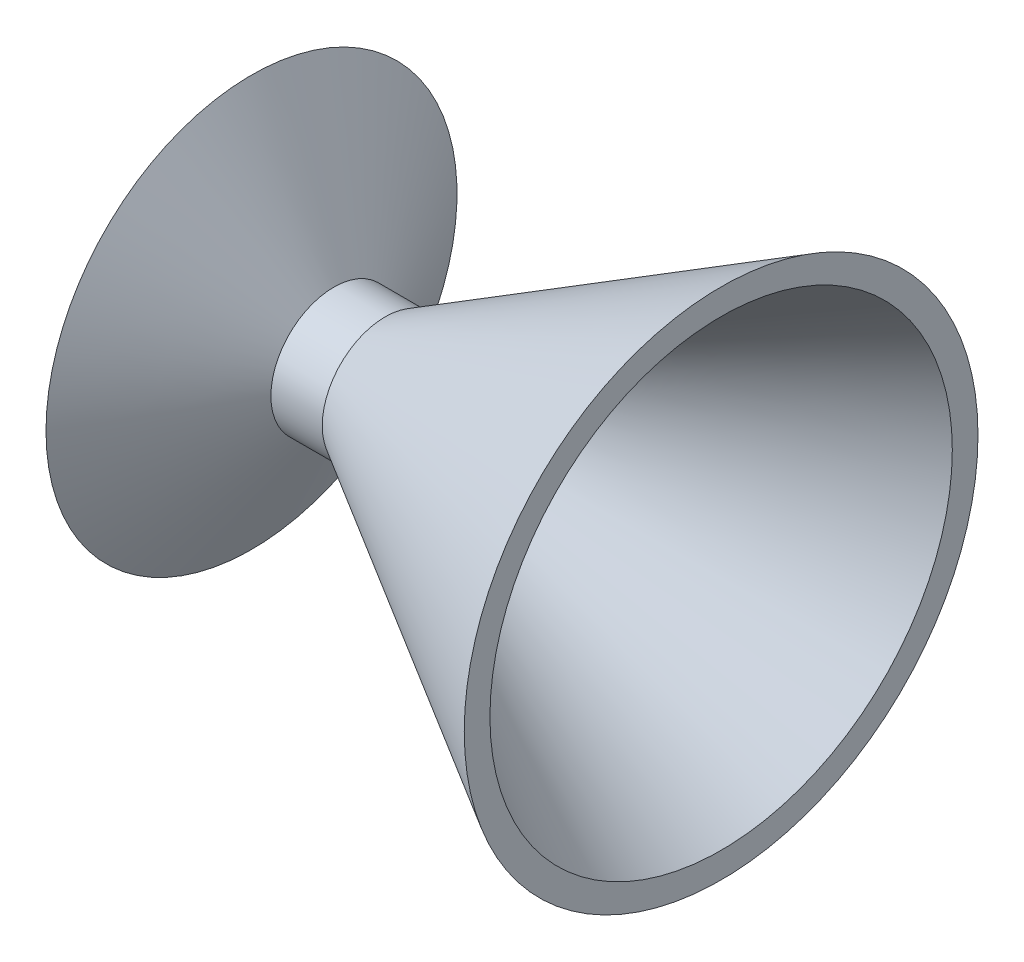
ISO-10303-21;
HEADER;
FILE_DESCRIPTION(('STEP AP214'),'2;1');
FILE_NAME('part.step','',(''),(''),'','','');
FILE_SCHEMA(('AUTOMOTIVE_DESIGN { 1 0 10303 214 1 1 1 1 }'));
ENDSEC;
DATA;
#1=APPLICATION_CONTEXT('core data for automotive mechanical design processes');
#2=APPLICATION_PROTOCOL_DEFINITION('international standard','automotive_design',2000,#1);
#3=PRODUCT_CONTEXT('',#1,'mechanical');
#4=PRODUCT('Part','Part','',(#3));
#5=PRODUCT_RELATED_PRODUCT_CATEGORY('part','',(#4));
#6=PRODUCT_DEFINITION_FORMATION('','',#4);
#7=PRODUCT_DEFINITION_CONTEXT('part definition',#1,'design');
#8=PRODUCT_DEFINITION('design','',#6,#7);
#9=PRODUCT_DEFINITION_SHAPE('','',#8);
#10=(LENGTH_UNIT() NAMED_UNIT(*) SI_UNIT(.MILLI.,.METRE.));
#11=(NAMED_UNIT(*) PLANE_ANGLE_UNIT() SI_UNIT($,.RADIAN.));
#12=(NAMED_UNIT(*) SI_UNIT($,.STERADIAN.) SOLID_ANGLE_UNIT());
#13=UNCERTAINTY_MEASURE_WITH_UNIT(LENGTH_MEASURE(1.E-05),#10,'distance_accuracy_value','');
#14=(GEOMETRIC_REPRESENTATION_CONTEXT(3) GLOBAL_UNCERTAINTY_ASSIGNED_CONTEXT((#13)) GLOBAL_UNIT_ASSIGNED_CONTEXT((#10,
#11,#12)) REPRESENTATION_CONTEXT('',''));
#15=CARTESIAN_POINT('',(0.,0.,0.));
#16=DIRECTION('',(0.,0.,1.));
#17=DIRECTION('',(1.,0.,0.));
#18=AXIS2_PLACEMENT_3D('',#15,#16,#17);
#19=CARTESIAN_POINT('',(0.,0.,0.));
#20=DIRECTION('',(-1.,0.,0.));
#21=DIRECTION('',(0.,0.,1.));
#22=AXIS2_PLACEMENT_3D('',#19,#20,#21);
#23=CYLINDRICAL_SURFACE('',#22,15.5575);
#24=CARTESIAN_POINT('',(-12.7,0.,0.));
#25=DIRECTION('',(-1.,0.,0.));
#26=DIRECTION('',(0.,0.,1.));
#27=AXIS2_PLACEMENT_3D('',#24,#25,#26);
#28=CIRCLE('',#27,15.5575);
#29=CARTESIAN_POINT('',(-12.7,0.,15.5575));
#30=VERTEX_POINT('',#29);
#31=EDGE_CURVE('E10',#30,#30,#28,.T.);
#32=ORIENTED_EDGE('',*,*,#31,.F.);
#33=EDGE_LOOP('',(#32));
#34=FACE_BOUND('',#33,.T.);
#35=CARTESIAN_POINT('',(0.,0.,0.));
#36=DIRECTION('',(-1.,0.,0.));
#37=DIRECTION('',(0.,0.,1.));
#38=AXIS2_PLACEMENT_3D('',#35,#36,#37);
#39=CIRCLE('',#38,15.5575);
#40=CARTESIAN_POINT('',(0.,0.,-15.5575));
#41=VERTEX_POINT('',#40);
#42=EDGE_CURVE('E62',#41,#41,#39,.T.);
#43=ORIENTED_EDGE('',*,*,#42,.T.);
#44=EDGE_LOOP('',(#43));
#45=FACE_BOUND('',#44,.T.);
#46=ADVANCED_FACE('F34',(#34,#45),#23,.T.);
#47=CARTESIAN_POINT('',(-12.7,0.,0.));
#48=DIRECTION('',(-1.,0.,0.));
#49=DIRECTION('',(0.,0.,1.));
#50=AXIS2_PLACEMENT_3D('',#47,#48,#49);
#51=CONICAL_SURFACE('',#50,15.5575,1.04719755119659);
#52=CARTESIAN_POINT('',(-33.0472668619156,0.,0.));
#53=DIRECTION('',(-1.,0.,0.));
#54=DIRECTION('',(0.,0.,1.));
#55=AXIS2_PLACEMENT_3D('',#52,#53,#54);
#56=CIRCLE('',#55,50.8);
#57=CARTESIAN_POINT('',(-33.0472668619156,0.,50.8));
#58=VERTEX_POINT('',#57);
#59=EDGE_CURVE('E40',#58,#58,#56,.T.);
#60=CARTESIAN_POINT('',(-33.0472668619156,0.,50.8));
#61=CARTESIAN_POINT('',(-32.8353161654373,0.,50.432890625));
#62=CARTESIAN_POINT('',(-32.623365468959,0.,50.06578125));
#63=CARTESIAN_POINT('',(-32.1994640760025,0.,49.3315625));
#64=CARTESIAN_POINT('',(-31.9875133795242,0.,48.964453125));
#65=CARTESIAN_POINT('',(-31.5636119865676,0.,48.230234375));
#66=CARTESIAN_POINT('',(-31.3516612900893,0.,47.863125));
#67=CARTESIAN_POINT('',(-30.9277598971327,0.,47.12890625));
#68=CARTESIAN_POINT('',(-30.7158092006545,0.,46.761796875));
#69=CARTESIAN_POINT('',(-30.2919078076979,0.,46.027578125));
#70=CARTESIAN_POINT('',(-30.0799571112196,0.,45.66046875));
#71=CARTESIAN_POINT('',(-29.656055718263,0.,44.92625));
#72=CARTESIAN_POINT('',(-29.4441050217847,0.,44.559140625));
#73=CARTESIAN_POINT('',(-29.0202036288281,0.,43.824921875));
#74=CARTESIAN_POINT('',(-28.8082529323499,0.,43.4578125));
#75=CARTESIAN_POINT('',(-28.3843515393933,0.,42.72359375));
#76=CARTESIAN_POINT('',(-28.172400842915,0.,42.356484375));
#77=CARTESIAN_POINT('',(-27.7484994499584,0.,41.622265625));
#78=CARTESIAN_POINT('',(-27.5365487534801,0.,41.25515625));
#79=CARTESIAN_POINT('',(-27.1126473605236,0.,40.5209375));
#80=CARTESIAN_POINT('',(-26.9006966640453,0.,40.153828125));
#81=CARTESIAN_POINT('',(-26.4767952710887,0.,39.419609375));
#82=CARTESIAN_POINT('',(-26.2648445746104,0.,39.0525));
#83=CARTESIAN_POINT('',(-25.8409431816538,0.,38.31828125));
#84=CARTESIAN_POINT('',(-25.6289924851755,0.,37.951171875));
#85=CARTESIAN_POINT('',(-25.205091092219,0.,37.216953125));
#86=CARTESIAN_POINT('',(-24.9931403957407,0.,36.84984375));
#87=CARTESIAN_POINT('',(-24.5692390027841,0.,36.115625));
#88=CARTESIAN_POINT('',(-24.3572883063058,0.,35.748515625));
#89=CARTESIAN_POINT('',(-23.9333869133492,0.,35.014296875));
#90=CARTESIAN_POINT('',(-23.721436216871,0.,34.6471875));
#91=CARTESIAN_POINT('',(-23.2975348239144,0.,33.91296875));
#92=CARTESIAN_POINT('',(-23.0855841274361,0.,33.545859375));
#93=CARTESIAN_POINT('',(-22.6616827344795,0.,32.811640625));
#94=CARTESIAN_POINT('',(-22.4497320380012,0.,32.44453125));
#95=CARTESIAN_POINT('',(-22.0258306450447,0.,31.7103125));
#96=CARTESIAN_POINT('',(-21.8138799485664,0.,31.343203125));
#97=CARTESIAN_POINT('',(-21.3899785556098,0.,30.608984375));
#98=CARTESIAN_POINT('',(-21.1780278591315,0.,30.241875));
#99=CARTESIAN_POINT('',(-20.7541264661749,0.,29.50765625));
#100=CARTESIAN_POINT('',(-20.5421757696966,0.,29.140546875));
#101=CARTESIAN_POINT('',(-20.1182743767401,0.,28.406328125));
#102=CARTESIAN_POINT('',(-19.9063236802618,0.,28.03921875));
#103=CARTESIAN_POINT('',(-19.4824222873052,0.,27.305));
#104=CARTESIAN_POINT('',(-19.2704715908269,0.,26.937890625));
#105=CARTESIAN_POINT('',(-18.8465701978703,0.,26.203671875));
#106=CARTESIAN_POINT('',(-18.6346195013921,0.,25.8365625));
#107=CARTESIAN_POINT('',(-18.2107181084355,0.,25.10234375));
#108=CARTESIAN_POINT('',(-17.9987674119572,0.,24.735234375));
#109=CARTESIAN_POINT('',(-17.5748660190006,0.,24.001015625));
#110=CARTESIAN_POINT('',(-17.3629153225223,0.,23.63390625));
#111=CARTESIAN_POINT('',(-16.9390139295658,0.,22.8996875));
#112=CARTESIAN_POINT('',(-16.7270632330875,0.,22.532578125));
#113=CARTESIAN_POINT('',(-16.3031618401309,0.,21.798359375));
#114=CARTESIAN_POINT('',(-16.0912111436526,0.,21.43125));
#115=CARTESIAN_POINT('',(-15.667309750696,0.,20.69703125));
#116=CARTESIAN_POINT('',(-15.4553590542177,0.,20.329921875));
#117=CARTESIAN_POINT('',(-15.0314576612612,0.,19.595703125));
#118=CARTESIAN_POINT('',(-14.8195069647829,0.,19.22859375));
#119=CARTESIAN_POINT('',(-14.3956055718263,0.,18.494375));
#120=CARTESIAN_POINT('',(-14.183654875348,0.,18.127265625));
#121=CARTESIAN_POINT('',(-13.7597534823914,0.,17.393046875));
#122=CARTESIAN_POINT('',(-13.5478027859132,0.,17.0259375));
#123=CARTESIAN_POINT('',(-13.1239013929566,0.,16.29171875));
#124=CARTESIAN_POINT('',(-12.9119506964783,0.,15.924609375));
#125=CARTESIAN_POINT('',(-12.7,0.,15.5575));
#126=B_SPLINE_CURVE_WITH_KNOTS('',3,(#60,#61,#62,#63,#64,#65,#66,#67,#68,#69,#70,#71,#72,#73,
#74,#75,#76,#77,#78,#79,#80,#81,#82,#83,#84,#85,#86,#87,#88,#89,#90,#91,#92,#93,#94,#95,#96,#97,
#98,#99,#100,#101,#102,#103,#104,#105,#106,#107,#108,#109,#110,#111,#112,#113,#114,#115,#116,
#117,#118,#119,#120,#121,#122,#123,#124,#125),.UNSPECIFIED.,.F.,.F.,(4,2,2,2,2,2,2,2,2,2,2,2,2,
2,2,2,2,2,2,2,2,2,2,2,2,2,2,2,2,2,2,2,4),(0.,1.27170417886971,2.54340835773943,3.81511253660914,
5.08681671547886,6.35852089434857,7.63022507321829,8.90192925208801,10.1736334309577,
11.4453376098274,12.7170417886972,13.9887459675669,15.2604501464366,16.5321543253063,
17.803858504176,19.0755626830457,20.3472668619154,21.6189710407852,22.8906752196549,
24.1623793985246,25.4340835773943,26.705787756264,27.9774919351337,29.2491961140034,
30.5209002928732,31.7926044717429,33.0643086506126,34.3360128294823,35.607717008352,
36.8794211872217,38.1511253660915,39.4228295449612,40.6945337238309),.UNSPECIFIED.);
#127=EDGE_CURVE('BSEAM99',#58,#30,#126,.T.);
#128=ORIENTED_EDGE('',*,*,#59,.F.);
#129=ORIENTED_EDGE('',*,*,#31,.T.);
#130=ORIENTED_EDGE('',*,*,#127,.T.);
#131=ORIENTED_EDGE('',*,*,#127,.F.);
#132=EDGE_LOOP('',(#128,#130,#129,#131));
#133=FACE_BOUND('',#132,.T.);
#134=ADVANCED_FACE('F99',(#133),#51,.T.);
#135=CARTESIAN_POINT('',(-33.0472668619156,50.8,0.));
#136=DIRECTION('',(1.,0.,0.));
#137=DIRECTION('',(0.,0.,-1.));
#138=AXIS2_PLACEMENT_3D('',#135,#136,#137);
#139=PLANE('',#138);
#140=CARTESIAN_POINT('',(-33.0472668619156,0.,0.));
#141=DIRECTION('',(-1.,0.,0.));
#142=DIRECTION('',(0.,0.,1.));
#143=AXIS2_PLACEMENT_3D('',#140,#141,#142);
#144=CIRCLE('',#143,41.275);
#145=CARTESIAN_POINT('',(-33.0472668619156,0.,41.275));
#146=VERTEX_POINT('',#145);
#147=EDGE_CURVE('E44',#146,#146,#144,.T.);
#148=ORIENTED_EDGE('',*,*,#147,.F.);
#149=EDGE_LOOP('',(#148));
#150=FACE_BOUND('',#149,.T.);
#151=ORIENTED_EDGE('',*,*,#59,.T.);
#152=EDGE_LOOP('',(#151));
#153=FACE_BOUND('',#152,.T.);
#154=ADVANCED_FACE('F94',(#150,#153),#139,.F.);
#155=CARTESIAN_POINT('',(-33.0472668619156,0.,0.));
#156=DIRECTION('',(-1.,0.,0.));
#157=DIRECTION('',(0.,0.,1.));
#158=AXIS2_PLACEMENT_3D('',#155,#156,#157);
#159=CONICAL_SURFACE('',#158,41.275,1.02280730700641);
#160=CARTESIAN_POINT('',(-12.7,0.,0.));
#161=DIRECTION('',(-1.,0.,0.));
#162=DIRECTION('',(0.,0.,1.));
#163=AXIS2_PLACEMENT_3D('',#160,#161,#162);
#164=CIRCLE('',#163,7.9375);
#165=CARTESIAN_POINT('',(-12.7,0.,7.9375));
#166=VERTEX_POINT('',#165);
#167=EDGE_CURVE('E48',#166,#166,#164,.T.);
#168=CARTESIAN_POINT('',(-12.7,0.,7.9375));
#169=CARTESIAN_POINT('',(-12.9119506964783,0.,8.284765625));
#170=CARTESIAN_POINT('',(-13.1239013929566,0.,8.63203125));
#171=CARTESIAN_POINT('',(-13.5478027859131,0.,9.3265625));
#172=CARTESIAN_POINT('',(-13.7597534823914,0.,9.673828125));
#173=CARTESIAN_POINT('',(-14.183654875348,0.,10.368359375));
#174=CARTESIAN_POINT('',(-14.3956055718263,0.,10.715625));
#175=CARTESIAN_POINT('',(-14.8195069647829,0.,11.41015625));
#176=CARTESIAN_POINT('',(-15.0314576612612,0.,11.757421875));
#177=CARTESIAN_POINT('',(-15.4553590542177,0.,12.451953125));
#178=CARTESIAN_POINT('',(-15.667309750696,0.,12.79921875));
#179=CARTESIAN_POINT('',(-16.0912111436526,0.,13.49375));
#180=CARTESIAN_POINT('',(-16.3031618401309,0.,13.841015625));
#181=CARTESIAN_POINT('',(-16.7270632330875,0.,14.535546875));
#182=CARTESIAN_POINT('',(-16.9390139295658,0.,14.8828125));
#183=CARTESIAN_POINT('',(-17.3629153225223,0.,15.57734375));
#184=CARTESIAN_POINT('',(-17.5748660190006,0.,15.924609375));
#185=CARTESIAN_POINT('',(-17.9987674119572,0.,16.619140625));
#186=CARTESIAN_POINT('',(-18.2107181084355,0.,16.96640625));
#187=CARTESIAN_POINT('',(-18.6346195013921,0.,17.6609375));
#188=CARTESIAN_POINT('',(-18.8465701978703,0.,18.008203125));
#189=CARTESIAN_POINT('',(-19.2704715908269,0.,18.702734375));
#190=CARTESIAN_POINT('',(-19.4824222873052,0.,19.05));
#191=CARTESIAN_POINT('',(-19.9063236802618,0.,19.74453125));
#192=CARTESIAN_POINT('',(-20.1182743767401,0.,20.091796875));
#193=CARTESIAN_POINT('',(-20.5421757696966,0.,20.786328125));
#194=CARTESIAN_POINT('',(-20.7541264661749,0.,21.13359375));
#195=CARTESIAN_POINT('',(-21.1780278591315,0.,21.828125));
#196=CARTESIAN_POINT('',(-21.3899785556098,0.,22.175390625));
#197=CARTESIAN_POINT('',(-21.8138799485664,0.,22.869921875));
#198=CARTESIAN_POINT('',(-22.0258306450447,0.,23.2171875));
#199=CARTESIAN_POINT('',(-22.4497320380012,0.,23.91171875));
#200=CARTESIAN_POINT('',(-22.6616827344795,0.,24.258984375));
#201=CARTESIAN_POINT('',(-23.0855841274361,0.,24.953515625));
#202=CARTESIAN_POINT('',(-23.2975348239144,0.,25.30078125));
#203=CARTESIAN_POINT('',(-23.721436216871,0.,25.9953125));
#204=CARTESIAN_POINT('',(-23.9333869133493,0.,26.342578125));
#205=CARTESIAN_POINT('',(-24.3572883063058,0.,27.037109375));
#206=CARTESIAN_POINT('',(-24.5692390027841,0.,27.384375));
#207=CARTESIAN_POINT('',(-24.9931403957407,0.,28.07890625));
#208=CARTESIAN_POINT('',(-25.205091092219,0.,28.426171875));
#209=CARTESIAN_POINT('',(-25.6289924851755,0.,29.120703125));
#210=CARTESIAN_POINT('',(-25.8409431816538,0.,29.46796875));
#211=CARTESIAN_POINT('',(-26.2648445746104,0.,30.1625));
#212=CARTESIAN_POINT('',(-26.4767952710887,0.,30.509765625));
#213=CARTESIAN_POINT('',(-26.9006966640453,0.,31.204296875));
#214=CARTESIAN_POINT('',(-27.1126473605236,0.,31.5515625));
#215=CARTESIAN_POINT('',(-27.5365487534801,0.,32.24609375));
#216=CARTESIAN_POINT('',(-27.7484994499584,0.,32.593359375));
#217=CARTESIAN_POINT('',(-28.172400842915,0.,33.287890625));
#218=CARTESIAN_POINT('',(-28.3843515393933,0.,33.63515625));
#219=CARTESIAN_POINT('',(-28.8082529323499,0.,34.3296875));
#220=CARTESIAN_POINT('',(-29.0202036288282,0.,34.676953125));
#221=CARTESIAN_POINT('',(-29.4441050217847,0.,35.371484375));
#222=CARTESIAN_POINT('',(-29.656055718263,0.,35.71875));
#223=CARTESIAN_POINT('',(-30.0799571112196,0.,36.41328125));
#224=CARTESIAN_POINT('',(-30.2919078076979,0.,36.760546875));
#225=CARTESIAN_POINT('',(-30.7158092006545,0.,37.455078125));
#226=CARTESIAN_POINT('',(-30.9277598971327,0.,37.80234375));
#227=CARTESIAN_POINT('',(-31.3516612900893,0.,38.496875));
#228=CARTESIAN_POINT('',(-31.5636119865676,0.,38.844140625));
#229=CARTESIAN_POINT('',(-31.9875133795242,0.,39.538671875));
#230=CARTESIAN_POINT('',(-32.1994640760025,0.,39.8859375));
#231=CARTESIAN_POINT('',(-32.623365468959,0.,40.58046875));
#232=CARTESIAN_POINT('',(-32.8353161654373,0.,40.927734375));
#233=CARTESIAN_POINT('',(-33.0472668619156,0.,41.275));
#234=B_SPLINE_CURVE_WITH_KNOTS('',3,(#168,#169,#170,#171,#172,#173,#174,#175,#176,#177,#178,
#179,#180,#181,#182,#183,#184,#185,#186,#187,#188,#189,#190,#191,#192,#193,#194,#195,#196,#197,
#198,#199,#200,#201,#202,#203,#204,#205,#206,#207,#208,#209,#210,#211,#212,#213,#214,#215,#216,
#217,#218,#219,#220,#221,#222,#223,#224,#225,#226,#227,#228,#229,#230,#231,#232,#233),
.UNSPECIFIED.,.F.,.F.,(4,2,2,2,2,2,2,2,2,2,2,2,2,2,2,2,2,2,2,2,2,2,2,2,2,2,2,2,2,2,2,2,4),(0.,
1.22051161747787,2.44102323495574,3.66153485243361,4.88204646991148,6.10255808738935,
7.32306970486722,8.54358132234509,9.76409293982296,10.9846045573008,12.2051161747787,
13.4256277922566,14.6461394097344,15.8666510272123,17.0871626446902,18.307674262168,
19.5281858796459,20.7486974971238,21.9692091146017,23.1897207320795,24.4102323495574,
25.6307439670353,26.8512555845131,28.071767201991,29.2922788194689,30.5127904369468,
31.7333020544246,32.9538136719025,34.1743252893804,35.3948369068582,36.6153485243361,
37.835860141814,39.0563717592918),.UNSPECIFIED.);
#235=EDGE_CURVE('BSEAM88',#166,#146,#234,.T.);
#236=ORIENTED_EDGE('',*,*,#167,.F.);
#237=ORIENTED_EDGE('',*,*,#147,.T.);
#238=ORIENTED_EDGE('',*,*,#235,.T.);
#239=ORIENTED_EDGE('',*,*,#235,.F.);
#240=EDGE_LOOP('',(#236,#238,#237,#239));
#241=FACE_BOUND('',#240,.T.);
#242=ADVANCED_FACE('F88',(#241),#159,.F.);
#243=CARTESIAN_POINT('',(0.,0.,0.));
#244=DIRECTION('',(-1.,0.,0.));
#245=DIRECTION('',(0.,0.,1.));
#246=AXIS2_PLACEMENT_3D('',#243,#244,#245);
#247=CYLINDRICAL_SURFACE('',#246,7.9375);
#248=CARTESIAN_POINT('',(0.,0.,0.));
#249=DIRECTION('',(-1.,0.,0.));
#250=DIRECTION('',(0.,0.,1.));
#251=AXIS2_PLACEMENT_3D('',#248,#249,#250);
#252=CIRCLE('',#251,7.9375);
#253=CARTESIAN_POINT('',(0.,0.,-7.9375));
#254=VERTEX_POINT('',#253);
#255=EDGE_CURVE('E53',#254,#254,#252,.T.);
#256=ORIENTED_EDGE('',*,*,#255,.F.);
#257=EDGE_LOOP('',(#256));
#258=FACE_BOUND('',#257,.T.);
#259=ORIENTED_EDGE('',*,*,#167,.T.);
#260=EDGE_LOOP('',(#259));
#261=FACE_BOUND('',#260,.T.);
#262=ADVANCED_FACE('F82',(#258,#261),#247,.F.);
#263=CARTESIAN_POINT('',(0.,0.,0.));
#264=DIRECTION('',(1.,0.,0.));
#265=DIRECTION('',(0.,0.,-1.));
#266=AXIS2_PLACEMENT_3D('',#263,#264,#265);
#267=CONICAL_SURFACE('',#266,7.9375,0.534993353531431);
#268=CARTESIAN_POINT('',(83.0388458418706,0.,0.));
#269=DIRECTION('',(-1.,0.,0.));
#270=DIRECTION('',(0.,0.,1.));
#271=AXIS2_PLACEMENT_3D('',#268,#269,#270);
#272=CIRCLE('',#271,57.15);
#273=CARTESIAN_POINT('',(83.0388458418706,0.,-57.15));
#274=VERTEX_POINT('',#273);
#275=EDGE_CURVE('E56',#274,#274,#272,.T.);
#276=CARTESIAN_POINT('',(83.0388458418706,0.,-57.15));
#277=CARTESIAN_POINT('',(82.1738578643511,0.,-56.6373697916667));
#278=CARTESIAN_POINT('',(81.3088698868317,0.,-56.1247395833333));
#279=CARTESIAN_POINT('',(79.5788939317927,0.,-55.0994791666667));
#280=CARTESIAN_POINT('',(78.7139059542732,0.,-54.5868489583333));
#281=CARTESIAN_POINT('',(76.9839299992342,0.,-53.5615885416667));
#282=CARTESIAN_POINT('',(76.1189420217147,0.,-53.0489583333333));
#283=CARTESIAN_POINT('',(74.3889660666758,0.,-52.0236979166667));
#284=CARTESIAN_POINT('',(73.5239780891563,0.,-51.5110677083333));
#285=CARTESIAN_POINT('',(71.7940021341173,0.,-50.4858072916667));
#286=CARTESIAN_POINT('',(70.9290141565978,0.,-49.9731770833333));
#287=CARTESIAN_POINT('',(69.1990382015589,0.,-48.9479166666667));
#288=CARTESIAN_POINT('',(68.3340502240394,0.,-48.4352864583333));
#289=CARTESIAN_POINT('',(66.6040742690004,0.,-47.4100260416667));
#290=CARTESIAN_POINT('',(65.7390862914809,0.,-46.8973958333333));
#291=CARTESIAN_POINT('',(64.0091103364419,0.,-45.8721354166667));
#292=CARTESIAN_POINT('',(63.1441223589225,0.,-45.3595052083333));
#293=CARTESIAN_POINT('',(61.4141464038835,0.,-44.3342447916667));
#294=CARTESIAN_POINT('',(60.549158426364,0.,-43.8216145833333));
#295=CARTESIAN_POINT('',(58.819182471325,0.,-42.7963541666667));
#296=CARTESIAN_POINT('',(57.9541944938055,0.,-42.2837239583333));
#297=CARTESIAN_POINT('',(56.2242185387666,0.,-41.2584635416667));
#298=CARTESIAN_POINT('',(55.3592305612471,0.,-40.7458333333333));
#299=CARTESIAN_POINT('',(53.6292546062081,0.,-39.7205729166667));
#300=CARTESIAN_POINT('',(52.7642666286886,0.,-39.2079427083333));
#301=CARTESIAN_POINT('',(51.0342906736497,0.,-38.1826822916667));
#302=CARTESIAN_POINT('',(50.1693026961302,0.,-37.6700520833333));
#303=CARTESIAN_POINT('',(48.4393267410912,0.,-36.6447916666667));
#304=CARTESIAN_POINT('',(47.5743387635717,0.,-36.1321614583333));
#305=CARTESIAN_POINT('',(45.8443628085327,0.,-35.1069010416667));
#306=CARTESIAN_POINT('',(44.9793748310133,0.,-34.5942708333333));
#307=CARTESIAN_POINT('',(43.2493988759743,0.,-33.5690104166667));
#308=CARTESIAN_POINT('',(42.3844108984548,0.,-33.0563802083333));
#309=CARTESIAN_POINT('',(40.6544349434158,0.,-32.0311197916667));
#310=CARTESIAN_POINT('',(39.7894469658963,0.,-31.5184895833333));
#311=CARTESIAN_POINT('',(38.0594710108574,0.,-30.4932291666667));
#312=CARTESIAN_POINT('',(37.1944830333379,0.,-29.9805989583333));
#313=CARTESIAN_POINT('',(35.4645070782989,0.,-28.9553385416667));
#314=CARTESIAN_POINT('',(34.5995191007794,0.,-28.4427083333333));
#315=CARTESIAN_POINT('',(32.8695431457405,0.,-27.4174479166667));
#316=CARTESIAN_POINT('',(32.004555168221,0.,-26.9048177083333));
#317=CARTESIAN_POINT('',(30.274579213182,0.,-25.8795572916667));
#318=CARTESIAN_POINT('',(29.4095912356625,0.,-25.3669270833333));
#319=CARTESIAN_POINT('',(27.6796152806235,0.,-24.3416666666667));
#320=CARTESIAN_POINT('',(26.8146273031041,0.,-23.8290364583333));
#321=CARTESIAN_POINT('',(25.0846513480651,0.,-22.8037760416667));
#322=CARTESIAN_POINT('',(24.2196633705456,0.,-22.2911458333333));
#323=CARTESIAN_POINT('',(22.4896874155066,0.,-21.2658854166667));
#324=CARTESIAN_POINT('',(21.6246994379871,0.,-20.7532552083333));
#325=CARTESIAN_POINT('',(19.8947234829482,0.,-19.7279947916667));
#326=CARTESIAN_POINT('',(19.0297355054287,0.,-19.2153645833333));
#327=CARTESIAN_POINT('',(17.2997595503897,0.,-18.1901041666667));
#328=CARTESIAN_POINT('',(16.4347715728702,0.,-17.6774739583333));
#329=CARTESIAN_POINT('',(14.7047956178313,0.,-16.6522135416667));
#330=CARTESIAN_POINT('',(13.8398076403118,0.,-16.1395833333333));
#331=CARTESIAN_POINT('',(12.1098316852728,0.,-15.1143229166667));
#332=CARTESIAN_POINT('',(11.2448437077533,0.,-14.6016927083333));
#333=CARTESIAN_POINT('',(9.51486775271434,0.,-13.5764322916667));
#334=CARTESIAN_POINT('',(8.64987977519486,0.,-13.0638020833333));
#335=CARTESIAN_POINT('',(6.91990382015589,0.,-12.0385416666667));
#336=CARTESIAN_POINT('',(6.0549158426364,0.,-11.5259114583333));
#337=CARTESIAN_POINT('',(4.32493988759743,0.,-10.5006510416667));
#338=CARTESIAN_POINT('',(3.45995191007794,0.,-9.98802083333333));
#339=CARTESIAN_POINT('',(1.72997595503897,0.,-8.96276041666667));
#340=CARTESIAN_POINT('',(0.864987977519484,0.,-8.45013020833333));
#341=CARTESIAN_POINT('',(0.,0.,-7.9375));
#342=B_SPLINE_CURVE_WITH_KNOTS('',3,(#276,#277,#278,#279,#280,#281,#282,#283,#284,#285,#286,
#287,#288,#289,#290,#291,#292,#293,#294,#295,#296,#297,#298,#299,#300,#301,#302,#303,#304,#305,
#306,#307,#308,#309,#310,#311,#312,#313,#314,#315,#316,#317,#318,#319,#320,#321,#322,#323,#324,
#325,#326,#327,#328,#329,#330,#331,#332,#333,#334,#335,#336,#337,#338,#339,#340,#341),
.UNSPECIFIED.,.F.,.F.,(4,2,2,2,2,2,2,2,2,2,2,2,2,2,2,2,2,2,2,2,2,2,2,2,2,2,2,2,2,2,2,2,4),(0.,
3.01644582012376,6.03289164024754,9.0493374603713,12.0657832804951,15.0822291006188,
18.0986749207426,21.1151207408664,24.1315665609901,27.1480123811139,30.1644582012377,
33.1809040213614,36.1973498414852,39.2137956616089,42.2302414817327,45.2466873018565,
48.2631331219803,51.279578942104,54.2960247622278,57.3124705823516,60.3289164024753,
63.3453622225991,66.3618080427229,69.3782538628466,72.3946996829704,75.4111455030942,
78.4275913232179,81.4440371433417,84.4604829634655,87.4769287835892,90.493374603713,
93.5098204238368,96.5262662439606),.UNSPECIFIED.);
#343=EDGE_CURVE('BSEAM76',#274,#254,#342,.T.);
#344=ORIENTED_EDGE('',*,*,#275,.F.);
#345=ORIENTED_EDGE('',*,*,#255,.T.);
#346=ORIENTED_EDGE('',*,*,#343,.T.);
#347=ORIENTED_EDGE('',*,*,#343,.F.);
#348=EDGE_LOOP('',(#344,#346,#345,#347));
#349=FACE_BOUND('',#348,.T.);
#350=ADVANCED_FACE('F76',(#349),#267,.F.);
#351=CARTESIAN_POINT('',(83.0388458418706,63.5,0.));
#352=DIRECTION('',(-1.,0.,0.));
#353=DIRECTION('',(0.,0.,1.));
#354=AXIS2_PLACEMENT_3D('',#351,#352,#353);
#355=PLANE('',#354);
#356=CARTESIAN_POINT('',(83.0388458418706,0.,0.));
#357=DIRECTION('',(-1.,0.,0.));
#358=DIRECTION('',(0.,0.,1.));
#359=AXIS2_PLACEMENT_3D('',#356,#357,#358);
#360=CIRCLE('',#359,63.5);
#361=CARTESIAN_POINT('',(83.0388458418706,0.,-63.5));
#362=VERTEX_POINT('',#361);
#363=EDGE_CURVE('E59',#362,#362,#360,.T.);
#364=ORIENTED_EDGE('',*,*,#363,.F.);
#365=EDGE_LOOP('',(#364));
#366=FACE_BOUND('',#365,.T.);
#367=ORIENTED_EDGE('',*,*,#275,.T.);
#368=EDGE_LOOP('',(#367));
#369=FACE_BOUND('',#368,.T.);
#370=ADVANCED_FACE('F70',(#366,#369),#355,.F.);
#371=CARTESIAN_POINT('',(83.0388458418706,0.,0.));
#372=DIRECTION('',(1.,0.,0.));
#373=DIRECTION('',(0.,0.,-1.));
#374=AXIS2_PLACEMENT_3D('',#371,#372,#373);
#375=CONICAL_SURFACE('',#374,63.5,0.5235987755983);
#376=CARTESIAN_POINT('',(0.,0.,-15.5575));
#377=CARTESIAN_POINT('',(0.864987977519469,0.,-16.0569010416667));
#378=CARTESIAN_POINT('',(1.72997595503895,0.,-16.5563020833333));
#379=CARTESIAN_POINT('',(3.45995191007793,0.,-17.5551041666667));
#380=CARTESIAN_POINT('',(4.32493988759742,0.,-18.0545052083333));
#381=CARTESIAN_POINT('',(6.05491584263639,0.,-19.0533072916667));
#382=CARTESIAN_POINT('',(6.91990382015587,0.,-19.5527083333333));
#383=CARTESIAN_POINT('',(8.64987977519484,0.,-20.5515104166667));
#384=CARTESIAN_POINT('',(9.51486775271433,0.,-21.0509114583333));
#385=CARTESIAN_POINT('',(11.2448437077533,0.,-22.0497135416667));
#386=CARTESIAN_POINT('',(12.1098316852728,0.,-22.5491145833333));
#387=CARTESIAN_POINT('',(13.8398076403118,0.,-23.5479166666667));
#388=CARTESIAN_POINT('',(14.7047956178312,0.,-24.0473177083333));
#389=CARTESIAN_POINT('',(16.4347715728702,0.,-25.0461197916667));
#390=CARTESIAN_POINT('',(17.2997595503897,0.,-25.5455208333333));
#391=CARTESIAN_POINT('',(19.0297355054287,0.,-26.5443229166667));
#392=CARTESIAN_POINT('',(19.8947234829482,0.,-27.0437239583333));
#393=CARTESIAN_POINT('',(21.6246994379871,0.,-28.0425260416667));
#394=CARTESIAN_POINT('',(22.4896874155066,0.,-28.5419270833333));
#395=CARTESIAN_POINT('',(24.2196633705456,0.,-29.5407291666667));
#396=CARTESIAN_POINT('',(25.0846513480651,0.,-30.0401302083333));
#397=CARTESIAN_POINT('',(26.814627303104,0.,-31.0389322916667));
#398=CARTESIAN_POINT('',(27.6796152806235,0.,-31.5383333333333));
#399=CARTESIAN_POINT('',(29.4095912356625,0.,-32.5371354166667));
#400=CARTESIAN_POINT('',(30.274579213182,0.,-33.0365364583333));
#401=CARTESIAN_POINT('',(32.004555168221,0.,-34.0353385416667));
#402=CARTESIAN_POINT('',(32.8695431457404,0.,-34.5347395833333));
#403=CARTESIAN_POINT('',(34.5995191007794,0.,-35.5335416666667));
#404=CARTESIAN_POINT('',(35.4645070782989,0.,-36.0329427083333));
#405=CARTESIAN_POINT('',(37.1944830333379,0.,-37.0317447916667));
#406=CARTESIAN_POINT('',(38.0594710108574,0.,-37.5311458333333));
#407=CARTESIAN_POINT('',(39.7894469658963,0.,-38.5299479166667));
#408=CARTESIAN_POINT('',(40.6544349434158,0.,-39.0293489583333));
#409=CARTESIAN_POINT('',(42.3844108984548,0.,-40.0281510416667));
#410=CARTESIAN_POINT('',(43.2493988759743,0.,-40.5275520833333));
#411=CARTESIAN_POINT('',(44.9793748310132,0.,-41.5263541666667));
#412=CARTESIAN_POINT('',(45.8443628085327,0.,-42.0257552083333));
#413=CARTESIAN_POINT('',(47.5743387635717,0.,-43.0245572916667));
#414=CARTESIAN_POINT('',(48.4393267410912,0.,-43.5239583333333));
#415=CARTESIAN_POINT('',(50.1693026961302,0.,-44.5227604166667));
#416=CARTESIAN_POINT('',(51.0342906736496,0.,-45.0221614583333));
#417=CARTESIAN_POINT('',(52.7642666286886,0.,-46.0209635416667));
#418=CARTESIAN_POINT('',(53.6292546062081,0.,-46.5203645833333));
#419=CARTESIAN_POINT('',(55.3592305612471,0.,-47.5191666666667));
#420=CARTESIAN_POINT('',(56.2242185387666,0.,-48.0185677083333));
#421=CARTESIAN_POINT('',(57.9541944938055,0.,-49.0173697916667));
#422=CARTESIAN_POINT('',(58.819182471325,0.,-49.5167708333333));
#423=CARTESIAN_POINT('',(60.549158426364,0.,-50.5155729166667));
#424=CARTESIAN_POINT('',(61.4141464038835,0.,-51.0149739583333));
#425=CARTESIAN_POINT('',(63.1441223589224,0.,-52.0137760416667));
#426=CARTESIAN_POINT('',(64.0091103364419,0.,-52.5131770833333));
#427=CARTESIAN_POINT('',(65.7390862914809,0.,-53.5119791666667));
#428=CARTESIAN_POINT('',(66.6040742690004,0.,-54.0113802083333));
#429=CARTESIAN_POINT('',(68.3340502240393,0.,-55.0101822916667));
#430=CARTESIAN_POINT('',(69.1990382015588,0.,-55.5095833333333));
#431=CARTESIAN_POINT('',(70.9290141565978,0.,-56.5083854166667));
#432=CARTESIAN_POINT('',(71.7940021341173,0.,-57.0077864583333));
#433=CARTESIAN_POINT('',(73.5239780891563,0.,-58.0065885416667));
#434=CARTESIAN_POINT('',(74.3889660666758,0.,-58.5059895833333));
#435=CARTESIAN_POINT('',(76.1189420217147,0.,-59.5047916666667));
#436=CARTESIAN_POINT('',(76.9839299992342,0.,-60.0041927083333));
#437=CARTESIAN_POINT('',(78.7139059542732,0.,-61.0029947916667));
#438=CARTESIAN_POINT('',(79.5788939317927,0.,-61.5023958333333));
#439=CARTESIAN_POINT('',(81.3088698868316,0.,-62.5011979166667));
#440=CARTESIAN_POINT('',(82.1738578643511,0.,-63.0005989583333));
#441=CARTESIAN_POINT('',(83.0388458418706,0.,-63.5));
#442=B_SPLINE_CURVE_WITH_KNOTS('',3,(#376,#377,#378,#379,#380,#381,#382,#383,#384,#385,#386,
#387,#388,#389,#390,#391,#392,#393,#394,#395,#396,#397,#398,#399,#400,#401,#402,#403,#404,#405,
#406,#407,#408,#409,#410,#411,#412,#413,#414,#415,#416,#417,#418,#419,#420,#421,#422,#423,#424,
#425,#426,#427,#428,#429,#430,#431,#432,#433,#434,#435,#436,#437,#438,#439,#440,#441),
.UNSPECIFIED.,.F.,.F.,(4,2,2,2,2,2,2,2,2,2,2,2,2,2,2,2,2,2,2,2,2,2,2,2,2,2,2,2,2,2,2,2,4),(0.,
2.99640624999999,5.99281249999999,8.98921874999998,11.985625,14.98203125,17.9784375,
20.9748437499999,23.9712499999999,26.9676562499999,29.9640624999999,32.9604687499999,
35.9568749999999,38.9532812499999,41.9496874999999,44.9460937499999,47.9424999999999,
50.9389062499999,53.9353124999999,56.9317187499999,59.9281249999998,62.9245312499998,
65.9209374999999,68.9173437499998,71.9137499999998,74.9101562499998,77.9065624999998,
80.9029687499998,83.8993749999998,86.8957812499998,89.8921874999998,92.8885937499998,
95.8849999999998),.UNSPECIFIED.);
#443=EDGE_CURVE('BSEAM67',#41,#362,#442,.T.);
#444=ORIENTED_EDGE('',*,*,#42,.F.);
#445=ORIENTED_EDGE('',*,*,#363,.T.);
#446=ORIENTED_EDGE('',*,*,#443,.T.);
#447=ORIENTED_EDGE('',*,*,#443,.F.);
#448=EDGE_LOOP('',(#444,#446,#445,#447));
#449=FACE_BOUND('',#448,.T.);
#450=ADVANCED_FACE('F67',(#449),#375,.T.);
#451=CLOSED_SHELL('',(#46,#134,#154,#242,#262,#350,#370,#450));
#452=MANIFOLD_SOLID_BREP('B2',#451);
#453=ADVANCED_BREP_SHAPE_REPRESENTATION('',(#18,#452),#14);
#454=SHAPE_DEFINITION_REPRESENTATION(#9,#453);
ENDSEC;
END-ISO-10303-21;
